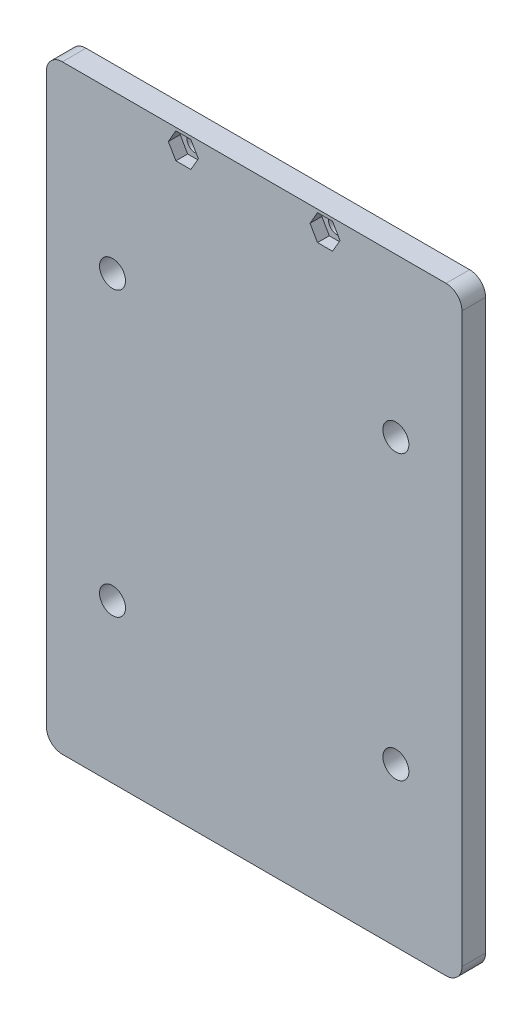
ISO-10303-21;
HEADER;
FILE_DESCRIPTION(('STEP AP214'),'2;1');
FILE_NAME('part.step','',(''),(''),'','','');
FILE_SCHEMA(('AUTOMOTIVE_DESIGN { 1 0 10303 214 1 1 1 1 }'));
ENDSEC;
DATA;
#1=APPLICATION_CONTEXT('core data for automotive mechanical design processes');
#2=APPLICATION_PROTOCOL_DEFINITION('international standard','automotive_design',2000,#1);
#3=PRODUCT_CONTEXT('',#1,'mechanical');
#4=PRODUCT('Part','Part','',(#3));
#5=PRODUCT_RELATED_PRODUCT_CATEGORY('part','',(#4));
#6=PRODUCT_DEFINITION_FORMATION('','',#4);
#7=PRODUCT_DEFINITION_CONTEXT('part definition',#1,'design');
#8=PRODUCT_DEFINITION('design','',#6,#7);
#9=PRODUCT_DEFINITION_SHAPE('','',#8);
#10=(LENGTH_UNIT() NAMED_UNIT(*) SI_UNIT(.MILLI.,.METRE.));
#11=(NAMED_UNIT(*) PLANE_ANGLE_UNIT() SI_UNIT($,.RADIAN.));
#12=(NAMED_UNIT(*) SI_UNIT($,.STERADIAN.) SOLID_ANGLE_UNIT());
#13=UNCERTAINTY_MEASURE_WITH_UNIT(LENGTH_MEASURE(1.E-05),#10,'distance_accuracy_value','');
#14=(GEOMETRIC_REPRESENTATION_CONTEXT(3) GLOBAL_UNCERTAINTY_ASSIGNED_CONTEXT((#13)) GLOBAL_UNIT_ASSIGNED_CONTEXT((#10,
#11,#12)) REPRESENTATION_CONTEXT('',''));
#15=CARTESIAN_POINT('',(0.,0.,0.));
#16=DIRECTION('',(0.,0.,1.));
#17=DIRECTION('',(1.,0.,0.));
#18=AXIS2_PLACEMENT_3D('',#15,#16,#17);
#19=CARTESIAN_POINT('',(386.881443411119,-1203.51516297916,5.));
#20=DIRECTION('',(0.,0.,-1.));
#21=DIRECTION('',(-1.,0.,0.));
#22=AXIS2_PLACEMENT_3D('',#19,#20,#21);
#23=CYLINDRICAL_SURFACE('',#22,1.74999999999997);
#24=CARTESIAN_POINT('',(386.881443411119,-1203.51516297916,0.));
#25=DIRECTION('',(0.,0.,1.));
#26=DIRECTION('',(1.,0.,0.));
#27=AXIS2_PLACEMENT_3D('',#24,#25,#26);
#28=CIRCLE('',#27,1.74999999999997);
#29=CARTESIAN_POINT('',(388.631443411119,-1203.51516297916,0.));
#30=VERTEX_POINT('',#29);
#31=EDGE_CURVE('E287',#30,#30,#28,.T.);
#32=ORIENTED_EDGE('',*,*,#31,.F.);
#33=EDGE_LOOP('',(#32));
#34=FACE_BOUND('',#33,.T.);
#35=CARTESIAN_POINT('',(386.881443411119,-1203.51516297916,2.5));
#36=DIRECTION('',(0.,0.,1.));
#37=DIRECTION('',(1.,0.,0.));
#38=AXIS2_PLACEMENT_3D('',#35,#36,#37);
#39=CIRCLE('',#38,1.74999999999997);
#40=CARTESIAN_POINT('',(388.631443411119,-1203.51516297916,2.5));
#41=VERTEX_POINT('',#40);
#42=EDGE_CURVE('E48',#41,#41,#39,.T.);
#43=ORIENTED_EDGE('',*,*,#42,.T.);
#44=EDGE_LOOP('',(#43));
#45=FACE_BOUND('',#44,.T.);
#46=ADVANCED_FACE('F44',(#34,#45),#23,.F.);
#47=CARTESIAN_POINT('',(416.881443411119,-1203.51516297916,5.));
#48=DIRECTION('',(0.,0.,-1.));
#49=DIRECTION('',(-1.,0.,0.));
#50=AXIS2_PLACEMENT_3D('',#47,#48,#49);
#51=CYLINDRICAL_SURFACE('',#50,1.74999999999997);
#52=CARTESIAN_POINT('',(416.881443411119,-1203.51516297916,0.));
#53=DIRECTION('',(0.,0.,1.));
#54=DIRECTION('',(1.,0.,0.));
#55=AXIS2_PLACEMENT_3D('',#52,#53,#54);
#56=CIRCLE('',#55,1.74999999999997);
#57=CARTESIAN_POINT('',(418.631443411119,-1203.51516297916,0.));
#58=VERTEX_POINT('',#57);
#59=EDGE_CURVE('E284',#58,#58,#56,.T.);
#60=ORIENTED_EDGE('',*,*,#59,.F.);
#61=EDGE_LOOP('',(#60));
#62=FACE_BOUND('',#61,.T.);
#63=CARTESIAN_POINT('',(416.881443411119,-1203.51516297916,2.5));
#64=DIRECTION('',(0.,0.,1.));
#65=DIRECTION('',(1.,0.,0.));
#66=AXIS2_PLACEMENT_3D('',#63,#64,#65);
#67=CIRCLE('',#66,1.74999999999997);
#68=CARTESIAN_POINT('',(418.631443411119,-1203.51516297916,2.5));
#69=VERTEX_POINT('',#68);
#70=EDGE_CURVE('E230',#69,#69,#67,.T.);
#71=ORIENTED_EDGE('',*,*,#70,.T.);
#72=EDGE_LOOP('',(#71));
#73=FACE_BOUND('',#72,.T.);
#74=ADVANCED_FACE('F383',(#62,#73),#51,.F.);
#75=CARTESIAN_POINT('',(442.501443411121,-1323.74516297915,5.));
#76=DIRECTION('',(0.,0.,1.));
#77=DIRECTION('',(1.,0.,0.));
#78=AXIS2_PLACEMENT_3D('',#75,#76,#77);
#79=PLANE('',#78);
#80=DIRECTION('',(-0.500000000000006,0.866025403784435,0.));
#81=VECTOR('',#80,1.);
#82=CARTESIAN_POINT('',(390.056869891662,-1203.51516297916,5.));
#83=LINE('',#82,#81);
#84=CARTESIAN_POINT('',(390.056869891662,-1203.51516297916,5.));
#85=VERTEX_POINT('',#84);
#86=CARTESIAN_POINT('',(388.469156651391,-1200.76516297916,5.));
#87=VERTEX_POINT('',#86);
#88=EDGE_CURVE('E61',#85,#87,#83,.T.);
#89=ORIENTED_EDGE('',*,*,#88,.F.);
#90=DIRECTION('',(0.499999999999993,0.866025403784442,0.));
#91=VECTOR('',#90,1.);
#92=CARTESIAN_POINT('',(388.469156651391,-1206.26516297916,5.));
#93=LINE('',#92,#91);
#94=CARTESIAN_POINT('',(388.469156651391,-1206.26516297916,5.));
#95=VERTEX_POINT('',#94);
#96=EDGE_CURVE('E204',#95,#85,#93,.T.);
#97=ORIENTED_EDGE('',*,*,#96,.F.);
#98=DIRECTION('',(1.,0.,0.));
#99=VECTOR('',#98,1.);
#100=CARTESIAN_POINT('',(385.293730170848,-1206.26516297916,5.));
#101=LINE('',#100,#99);
#102=CARTESIAN_POINT('',(385.293730170848,-1206.26516297916,5.));
#103=VERTEX_POINT('',#102);
#104=EDGE_CURVE('E207',#103,#95,#101,.T.);
#105=ORIENTED_EDGE('',*,*,#104,.F.);
#106=DIRECTION('',(0.500000000000006,-0.866025403784435,0.));
#107=VECTOR('',#106,1.);
#108=CARTESIAN_POINT('',(383.706016930576,-1203.51516297916,5.));
#109=LINE('',#108,#107);
#110=CARTESIAN_POINT('',(383.706016930576,-1203.51516297916,5.));
#111=VERTEX_POINT('',#110);
#112=EDGE_CURVE('E223',#111,#103,#109,.T.);
#113=ORIENTED_EDGE('',*,*,#112,.F.);
#114=DIRECTION('',(-0.499999999999993,-0.866025403784442,0.));
#115=VECTOR('',#114,1.);
#116=CARTESIAN_POINT('',(385.293730170848,-1200.76516297916,5.));
#117=LINE('',#116,#115);
#118=CARTESIAN_POINT('',(385.293730170848,-1200.76516297916,5.));
#119=VERTEX_POINT('',#118);
#120=EDGE_CURVE('E220',#119,#111,#117,.T.);
#121=ORIENTED_EDGE('',*,*,#120,.F.);
#122=DIRECTION('',(-1.,0.,0.));
#123=VECTOR('',#122,1.);
#124=CARTESIAN_POINT('',(388.469156651391,-1200.76516297916,5.));
#125=LINE('',#124,#123);
#126=EDGE_CURVE('E218',#87,#119,#125,.T.);
#127=ORIENTED_EDGE('',*,*,#126,.F.);
#128=EDGE_LOOP('',(#89,#97,#105,#113,#121,#127));
#129=FACE_BOUND('',#128,.T.);
#130=DIRECTION('',(-0.500000000000011,0.866025403784433,0.));
#131=VECTOR('',#130,1.);
#132=CARTESIAN_POINT('',(420.056869891662,-1203.51516297916,5.));
#133=LINE('',#132,#131);
#134=CARTESIAN_POINT('',(420.056869891662,-1203.51516297916,5.));
#135=VERTEX_POINT('',#134);
#136=CARTESIAN_POINT('',(418.469156651391,-1200.76516297916,5.));
#137=VERTEX_POINT('',#136);
#138=EDGE_CURVE('E69',#135,#137,#133,.T.);
#139=ORIENTED_EDGE('',*,*,#138,.F.);
#140=DIRECTION('',(0.499999999999989,0.866025403784445,0.));
#141=VECTOR('',#140,1.);
#142=CARTESIAN_POINT('',(418.469156651391,-1206.26516297916,5.));
#143=LINE('',#142,#141);
#144=CARTESIAN_POINT('',(418.469156651391,-1206.26516297916,5.));
#145=VERTEX_POINT('',#144);
#146=EDGE_CURVE('E251',#145,#135,#143,.T.);
#147=ORIENTED_EDGE('',*,*,#146,.F.);
#148=DIRECTION('',(1.,0.,0.));
#149=VECTOR('',#148,1.);
#150=CARTESIAN_POINT('',(415.293730170847,-1206.26516297916,5.));
#151=LINE('',#150,#149);
#152=CARTESIAN_POINT('',(415.293730170847,-1206.26516297916,5.));
#153=VERTEX_POINT('',#152);
#154=EDGE_CURVE('E254',#153,#145,#151,.T.);
#155=ORIENTED_EDGE('',*,*,#154,.F.);
#156=DIRECTION('',(0.499999999999984,-0.866025403784448,0.));
#157=VECTOR('',#156,1.);
#158=CARTESIAN_POINT('',(413.706016930576,-1203.51516297916,5.));
#159=LINE('',#158,#157);
#160=CARTESIAN_POINT('',(413.706016930576,-1203.51516297916,5.));
#161=VERTEX_POINT('',#160);
#162=EDGE_CURVE('E258',#161,#153,#159,.T.);
#163=ORIENTED_EDGE('',*,*,#162,.F.);
#164=DIRECTION('',(-0.500000000000002,-0.866025403784437,0.));
#165=VECTOR('',#164,1.);
#166=CARTESIAN_POINT('',(415.293730170848,-1200.76516297916,5.));
#167=LINE('',#166,#165);
#168=CARTESIAN_POINT('',(415.293730170848,-1200.76516297916,5.));
#169=VERTEX_POINT('',#168);
#170=EDGE_CURVE('E261',#169,#161,#167,.T.);
#171=ORIENTED_EDGE('',*,*,#170,.F.);
#172=DIRECTION('',(-1.,0.,0.));
#173=VECTOR('',#172,1.);
#174=CARTESIAN_POINT('',(418.469156651391,-1200.76516297916,5.));
#175=LINE('',#174,#173);
#176=EDGE_CURVE('E264',#137,#169,#175,.T.);
#177=ORIENTED_EDGE('',*,*,#176,.F.);
#178=EDGE_LOOP('',(#139,#147,#155,#163,#171,#177));
#179=FACE_BOUND('',#178,.T.);
#180=CARTESIAN_POINT('',(371.881443411121,-1293.62516297915,5.));
#181=DIRECTION('',(0.,0.,1.));
#182=DIRECTION('',(1.,0.,0.));
#183=AXIS2_PLACEMENT_3D('',#180,#181,#182);
#184=CIRCLE('',#183,2.74999999999997);
#185=CARTESIAN_POINT('',(374.631443411121,-1293.62516297915,5.));
#186=VERTEX_POINT('',#185);
#187=EDGE_CURVE('E297',#186,#186,#184,.T.);
#188=ORIENTED_EDGE('',*,*,#187,.F.);
#189=EDGE_LOOP('',(#188));
#190=FACE_BOUND('',#189,.T.);
#191=CARTESIAN_POINT('',(371.881443411121,-1233.62516297915,5.));
#192=DIRECTION('',(0.,0.,1.));
#193=DIRECTION('',(1.,0.,0.));
#194=AXIS2_PLACEMENT_3D('',#191,#192,#193);
#195=CIRCLE('',#194,2.74999999999997);
#196=CARTESIAN_POINT('',(374.631443411121,-1233.62516297915,5.));
#197=VERTEX_POINT('',#196);
#198=EDGE_CURVE('E309',#197,#197,#195,.T.);
#199=ORIENTED_EDGE('',*,*,#198,.F.);
#200=EDGE_LOOP('',(#199));
#201=FACE_BOUND('',#200,.T.);
#202=CARTESIAN_POINT('',(442.501443411121,-1323.74516297915,5.));
#203=DIRECTION('',(0.,0.,1.));
#204=DIRECTION('',(1.,0.,0.));
#205=AXIS2_PLACEMENT_3D('',#202,#203,#204);
#206=CIRCLE('',#205,3.37999999999994);
#207=CARTESIAN_POINT('',(442.501443411121,-1327.12516297915,5.));
#208=VERTEX_POINT('',#207);
#209=CARTESIAN_POINT('',(445.881443411121,-1323.74516297915,5.));
#210=VERTEX_POINT('',#209);
#211=EDGE_CURVE('E315',#208,#210,#206,.T.);
#212=ORIENTED_EDGE('',*,*,#211,.T.);
#213=DIRECTION('',(0.,1.,0.));
#214=VECTOR('',#213,1.);
#215=CARTESIAN_POINT('',(445.881443411121,-1323.74516297915,5.));
#216=LINE('',#215,#214);
#217=CARTESIAN_POINT('',(445.881443411121,-1203.50516297915,5.));
#218=VERTEX_POINT('',#217);
#219=EDGE_CURVE('E318',#210,#218,#216,.T.);
#220=ORIENTED_EDGE('',*,*,#219,.T.);
#221=CARTESIAN_POINT('',(442.501443411121,-1203.50516297915,5.));
#222=DIRECTION('',(0.,0.,1.));
#223=DIRECTION('',(1.,0.,0.));
#224=AXIS2_PLACEMENT_3D('',#221,#222,#223);
#225=CIRCLE('',#224,3.38000000000008);
#226=CARTESIAN_POINT('',(442.501443411121,-1200.12516297915,5.));
#227=VERTEX_POINT('',#226);
#228=EDGE_CURVE('E321',#218,#227,#225,.T.);
#229=ORIENTED_EDGE('',*,*,#228,.T.);
#230=DIRECTION('',(-1.,0.,0.));
#231=VECTOR('',#230,1.);
#232=CARTESIAN_POINT('',(442.501443411121,-1200.12516297915,5.));
#233=LINE('',#232,#231);
#234=CARTESIAN_POINT('',(361.261443411121,-1200.12516297915,5.));
#235=VERTEX_POINT('',#234);
#236=EDGE_CURVE('E323',#227,#235,#233,.T.);
#237=ORIENTED_EDGE('',*,*,#236,.T.);
#238=CARTESIAN_POINT('',(361.261443411121,-1203.50516297915,5.));
#239=DIRECTION('',(0.,0.,1.));
#240=DIRECTION('',(1.,0.,0.));
#241=AXIS2_PLACEMENT_3D('',#238,#239,#240);
#242=CIRCLE('',#241,3.37999999999994);
#243=CARTESIAN_POINT('',(357.881443411121,-1203.50516297915,5.));
#244=VERTEX_POINT('',#243);
#245=EDGE_CURVE('E325',#235,#244,#242,.T.);
#246=ORIENTED_EDGE('',*,*,#245,.T.);
#247=DIRECTION('',(0.,-1.,0.));
#248=VECTOR('',#247,1.);
#249=CARTESIAN_POINT('',(357.881443411121,-1203.50516297915,5.));
#250=LINE('',#249,#248);
#251=CARTESIAN_POINT('',(357.881443411121,-1323.74516297915,5.));
#252=VERTEX_POINT('',#251);
#253=EDGE_CURVE('E327',#244,#252,#250,.T.);
#254=ORIENTED_EDGE('',*,*,#253,.T.);
#255=CARTESIAN_POINT('',(361.261443411121,-1323.74516297915,5.));
#256=DIRECTION('',(0.,0.,1.));
#257=DIRECTION('',(1.,0.,0.));
#258=AXIS2_PLACEMENT_3D('',#255,#256,#257);
#259=CIRCLE('',#258,3.38000000000008);
#260=CARTESIAN_POINT('',(361.261443411121,-1327.12516297915,5.));
#261=VERTEX_POINT('',#260);
#262=EDGE_CURVE('E329',#252,#261,#259,.T.);
#263=ORIENTED_EDGE('',*,*,#262,.T.);
#264=DIRECTION('',(1.,0.,0.));
#265=VECTOR('',#264,1.);
#266=CARTESIAN_POINT('',(361.261443411121,-1327.12516297915,5.));
#267=LINE('',#266,#265);
#268=EDGE_CURVE('E331',#261,#208,#267,.T.);
#269=ORIENTED_EDGE('',*,*,#268,.T.);
#270=EDGE_LOOP('',(#212,#220,#229,#237,#246,#254,#263,#269));
#271=FACE_BOUND('',#270,.T.);
#272=CARTESIAN_POINT('',(431.881443411121,-1233.62516297915,5.));
#273=DIRECTION('',(0.,0.,1.));
#274=DIRECTION('',(1.,0.,0.));
#275=AXIS2_PLACEMENT_3D('',#272,#273,#274);
#276=CIRCLE('',#275,2.74999999999997);
#277=CARTESIAN_POINT('',(434.631443411121,-1233.62516297915,5.));
#278=VERTEX_POINT('',#277);
#279=EDGE_CURVE('E303',#278,#278,#276,.T.);
#280=ORIENTED_EDGE('',*,*,#279,.F.);
#281=EDGE_LOOP('',(#280));
#282=FACE_BOUND('',#281,.T.);
#283=CARTESIAN_POINT('',(431.881443411121,-1293.62516297915,5.));
#284=DIRECTION('',(0.,0.,1.));
#285=DIRECTION('',(1.,0.,0.));
#286=AXIS2_PLACEMENT_3D('',#283,#284,#285);
#287=CIRCLE('',#286,2.74999999999997);
#288=CARTESIAN_POINT('',(434.631443411121,-1293.62516297915,5.));
#289=VERTEX_POINT('',#288);
#290=EDGE_CURVE('E291',#289,#289,#287,.T.);
#291=ORIENTED_EDGE('',*,*,#290,.F.);
#292=EDGE_LOOP('',(#291));
#293=FACE_BOUND('',#292,.T.);
#294=ADVANCED_FACE('F390',(#129,#179,#190,#201,#271,#282,#293),#79,.T.);
#295=CARTESIAN_POINT('',(442.501443411121,-1323.74516297915,0.));
#296=DIRECTION('',(0.,0.,1.));
#297=DIRECTION('',(1.,0.,0.));
#298=AXIS2_PLACEMENT_3D('',#295,#296,#297);
#299=PLANE('',#298);
#300=CARTESIAN_POINT('',(442.501443411121,-1323.74516297915,0.));
#301=DIRECTION('',(0.,0.,1.));
#302=DIRECTION('',(1.,0.,0.));
#303=AXIS2_PLACEMENT_3D('',#300,#301,#302);
#304=CIRCLE('',#303,3.37999999999994);
#305=CARTESIAN_POINT('',(442.501443411121,-1327.12516297915,0.));
#306=VERTEX_POINT('',#305);
#307=CARTESIAN_POINT('',(445.881443411121,-1323.74516297915,0.));
#308=VERTEX_POINT('',#307);
#309=EDGE_CURVE('E312',#306,#308,#304,.T.);
#310=ORIENTED_EDGE('',*,*,#309,.F.);
#311=DIRECTION('',(1.,0.,0.));
#312=VECTOR('',#311,1.);
#313=CARTESIAN_POINT('',(361.261443411121,-1327.12516297915,0.));
#314=LINE('',#313,#312);
#315=CARTESIAN_POINT('',(361.261443411121,-1327.12516297915,0.));
#316=VERTEX_POINT('',#315);
#317=EDGE_CURVE('E319',#316,#306,#314,.T.);
#318=ORIENTED_EDGE('',*,*,#317,.F.);
#319=CARTESIAN_POINT('',(361.261443411121,-1323.74516297915,0.));
#320=DIRECTION('',(0.,0.,1.));
#321=DIRECTION('',(1.,0.,0.));
#322=AXIS2_PLACEMENT_3D('',#319,#320,#321);
#323=CIRCLE('',#322,3.38000000000008);
#324=CARTESIAN_POINT('',(357.881443411121,-1323.74516297915,0.));
#325=VERTEX_POINT('',#324);
#326=EDGE_CURVE('E346',#325,#316,#323,.T.);
#327=ORIENTED_EDGE('',*,*,#326,.F.);
#328=DIRECTION('',(0.,-1.,0.));
#329=VECTOR('',#328,1.);
#330=CARTESIAN_POINT('',(357.881443411121,-1203.50516297915,0.));
#331=LINE('',#330,#329);
#332=CARTESIAN_POINT('',(357.881443411121,-1203.50516297915,0.));
#333=VERTEX_POINT('',#332);
#334=EDGE_CURVE('E344',#333,#325,#331,.T.);
#335=ORIENTED_EDGE('',*,*,#334,.F.);
#336=CARTESIAN_POINT('',(361.261443411121,-1203.50516297915,0.));
#337=DIRECTION('',(0.,0.,1.));
#338=DIRECTION('',(1.,0.,0.));
#339=AXIS2_PLACEMENT_3D('',#336,#337,#338);
#340=CIRCLE('',#339,3.37999999999994);
#341=CARTESIAN_POINT('',(361.261443411121,-1200.12516297915,0.));
#342=VERTEX_POINT('',#341);
#343=EDGE_CURVE('E342',#342,#333,#340,.T.);
#344=ORIENTED_EDGE('',*,*,#343,.F.);
#345=DIRECTION('',(-1.,0.,0.));
#346=VECTOR('',#345,1.);
#347=CARTESIAN_POINT('',(442.501443411121,-1200.12516297915,0.));
#348=LINE('',#347,#346);
#349=CARTESIAN_POINT('',(442.501443411121,-1200.12516297915,0.));
#350=VERTEX_POINT('',#349);
#351=EDGE_CURVE('E340',#350,#342,#348,.T.);
#352=ORIENTED_EDGE('',*,*,#351,.F.);
#353=CARTESIAN_POINT('',(442.501443411121,-1203.50516297915,0.));
#354=DIRECTION('',(0.,0.,1.));
#355=DIRECTION('',(1.,0.,0.));
#356=AXIS2_PLACEMENT_3D('',#353,#354,#355);
#357=CIRCLE('',#356,3.38000000000008);
#358=CARTESIAN_POINT('',(445.881443411121,-1203.50516297915,0.));
#359=VERTEX_POINT('',#358);
#360=EDGE_CURVE('E338',#359,#350,#357,.T.);
#361=ORIENTED_EDGE('',*,*,#360,.F.);
#362=DIRECTION('',(0.,1.,0.));
#363=VECTOR('',#362,1.);
#364=CARTESIAN_POINT('',(445.881443411121,-1323.74516297915,0.));
#365=LINE('',#364,#363);
#366=EDGE_CURVE('E336',#308,#359,#365,.T.);
#367=ORIENTED_EDGE('',*,*,#366,.F.);
#368=EDGE_LOOP('',(#310,#318,#327,#335,#344,#352,#361,#367));
#369=FACE_BOUND('',#368,.T.);
#370=CARTESIAN_POINT('',(371.881443411121,-1233.62516297915,0.));
#371=DIRECTION('',(0.,0.,1.));
#372=DIRECTION('',(1.,0.,0.));
#373=AXIS2_PLACEMENT_3D('',#370,#371,#372);
#374=CIRCLE('',#373,2.74999999999997);
#375=CARTESIAN_POINT('',(374.631443411121,-1233.62516297915,0.));
#376=VERTEX_POINT('',#375);
#377=EDGE_CURVE('E306',#376,#376,#374,.T.);
#378=ORIENTED_EDGE('',*,*,#377,.T.);
#379=EDGE_LOOP('',(#378));
#380=FACE_BOUND('',#379,.T.);
#381=CARTESIAN_POINT('',(431.881443411121,-1233.62516297915,0.));
#382=DIRECTION('',(0.,0.,1.));
#383=DIRECTION('',(1.,0.,0.));
#384=AXIS2_PLACEMENT_3D('',#381,#382,#383);
#385=CIRCLE('',#384,2.74999999999997);
#386=CARTESIAN_POINT('',(434.631443411121,-1233.62516297915,0.));
#387=VERTEX_POINT('',#386);
#388=EDGE_CURVE('E300',#387,#387,#385,.T.);
#389=ORIENTED_EDGE('',*,*,#388,.T.);
#390=EDGE_LOOP('',(#389));
#391=FACE_BOUND('',#390,.T.);
#392=CARTESIAN_POINT('',(371.881443411121,-1293.62516297915,0.));
#393=DIRECTION('',(0.,0.,1.));
#394=DIRECTION('',(1.,0.,0.));
#395=AXIS2_PLACEMENT_3D('',#392,#393,#394);
#396=CIRCLE('',#395,2.74999999999997);
#397=CARTESIAN_POINT('',(374.631443411121,-1293.62516297915,0.));
#398=VERTEX_POINT('',#397);
#399=EDGE_CURVE('E294',#398,#398,#396,.T.);
#400=ORIENTED_EDGE('',*,*,#399,.T.);
#401=EDGE_LOOP('',(#400));
#402=FACE_BOUND('',#401,.T.);
#403=CARTESIAN_POINT('',(431.881443411121,-1293.62516297915,0.));
#404=DIRECTION('',(0.,0.,1.));
#405=DIRECTION('',(1.,0.,0.));
#406=AXIS2_PLACEMENT_3D('',#403,#404,#405);
#407=CIRCLE('',#406,2.74999999999997);
#408=CARTESIAN_POINT('',(434.631443411121,-1293.62516297915,0.));
#409=VERTEX_POINT('',#408);
#410=EDGE_CURVE('E290',#409,#409,#407,.T.);
#411=ORIENTED_EDGE('',*,*,#410,.T.);
#412=EDGE_LOOP('',(#411));
#413=FACE_BOUND('',#412,.T.);
#414=ORIENTED_EDGE('',*,*,#31,.T.);
#415=EDGE_LOOP('',(#414));
#416=FACE_BOUND('',#415,.T.);
#417=ORIENTED_EDGE('',*,*,#59,.T.);
#418=EDGE_LOOP('',(#417));
#419=FACE_BOUND('',#418,.T.);
#420=ADVANCED_FACE('F415',(#369,#380,#391,#402,#413,#416,#419),#299,.F.);
#421=CARTESIAN_POINT('',(442.501443411121,-1323.74516297915,5.));
#422=DIRECTION('',(0.,0.,-1.));
#423=DIRECTION('',(-1.,0.,0.));
#424=AXIS2_PLACEMENT_3D('',#421,#422,#423);
#425=CYLINDRICAL_SURFACE('',#424,3.37999999999994);
#426=ORIENTED_EDGE('',*,*,#309,.T.);
#427=DIRECTION('',(0.,0.,-1.));
#428=VECTOR('',#427,1.);
#429=CARTESIAN_POINT('',(445.881443411121,-1323.74516297915,5.));
#430=LINE('',#429,#428);
#431=EDGE_CURVE('E11',#210,#308,#430,.T.);
#432=ORIENTED_EDGE('',*,*,#431,.F.);
#433=ORIENTED_EDGE('',*,*,#211,.F.);
#434=DIRECTION('',(0.,0.,-1.));
#435=VECTOR('',#434,1.);
#436=CARTESIAN_POINT('',(442.501443411121,-1327.12516297915,5.));
#437=LINE('',#436,#435);
#438=EDGE_CURVE('E333',#208,#306,#437,.T.);
#439=ORIENTED_EDGE('',*,*,#438,.T.);
#440=EDGE_LOOP('',(#426,#432,#433,#439));
#441=FACE_BOUND('',#440,.T.);
#442=ADVANCED_FACE('F46',(#441),#425,.T.);
#443=CARTESIAN_POINT('',(445.881443411121,-1323.74516297915,5.));
#444=DIRECTION('',(-1.,0.,0.));
#445=DIRECTION('',(0.,0.,1.));
#446=AXIS2_PLACEMENT_3D('',#443,#444,#445);
#447=PLANE('',#446);
#448=ORIENTED_EDGE('',*,*,#366,.T.);
#449=DIRECTION('',(0.,0.,-1.));
#450=VECTOR('',#449,1.);
#451=CARTESIAN_POINT('',(445.881443411121,-1203.50516297915,5.));
#452=LINE('',#451,#450);
#453=EDGE_CURVE('E53',#218,#359,#452,.T.);
#454=ORIENTED_EDGE('',*,*,#453,.F.);
#455=ORIENTED_EDGE('',*,*,#219,.F.);
#456=ORIENTED_EDGE('',*,*,#431,.T.);
#457=EDGE_LOOP('',(#448,#454,#455,#456));
#458=FACE_BOUND('',#457,.T.);
#459=ADVANCED_FACE('F441',(#458),#447,.F.);
#460=CARTESIAN_POINT('',(442.501443411121,-1203.50516297915,5.));
#461=DIRECTION('',(0.,0.,-1.));
#462=DIRECTION('',(-1.,0.,0.));
#463=AXIS2_PLACEMENT_3D('',#460,#461,#462);
#464=CYLINDRICAL_SURFACE('',#463,3.38000000000008);
#465=ORIENTED_EDGE('',*,*,#360,.T.);
#466=DIRECTION('',(0.,0.,-1.));
#467=VECTOR('',#466,1.);
#468=CARTESIAN_POINT('',(442.501443411121,-1200.12516297915,5.));
#469=LINE('',#468,#467);
#470=EDGE_CURVE('E363',#227,#350,#469,.T.);
#471=ORIENTED_EDGE('',*,*,#470,.F.);
#472=ORIENTED_EDGE('',*,*,#228,.F.);
#473=ORIENTED_EDGE('',*,*,#453,.T.);
#474=EDGE_LOOP('',(#465,#471,#472,#473));
#475=FACE_BOUND('',#474,.T.);
#476=ADVANCED_FACE('F438',(#475),#464,.T.);
#477=CARTESIAN_POINT('',(442.501443411121,-1200.12516297915,5.));
#478=DIRECTION('',(0.,-1.,0.));
#479=DIRECTION('',(1.,0.,0.));
#480=AXIS2_PLACEMENT_3D('',#477,#478,#479);
#481=PLANE('',#480);
#482=ORIENTED_EDGE('',*,*,#351,.T.);
#483=DIRECTION('',(0.,0.,-1.));
#484=VECTOR('',#483,1.);
#485=CARTESIAN_POINT('',(361.261443411121,-1200.12516297915,5.));
#486=LINE('',#485,#484);
#487=EDGE_CURVE('E360',#235,#342,#486,.T.);
#488=ORIENTED_EDGE('',*,*,#487,.F.);
#489=ORIENTED_EDGE('',*,*,#236,.F.);
#490=ORIENTED_EDGE('',*,*,#470,.T.);
#491=EDGE_LOOP('',(#482,#488,#489,#490));
#492=FACE_BOUND('',#491,.T.);
#493=ADVANCED_FACE('F434',(#492),#481,.F.);
#494=CARTESIAN_POINT('',(361.261443411121,-1203.50516297915,5.));
#495=DIRECTION('',(0.,0.,-1.));
#496=DIRECTION('',(-1.,0.,0.));
#497=AXIS2_PLACEMENT_3D('',#494,#495,#496);
#498=CYLINDRICAL_SURFACE('',#497,3.37999999999994);
#499=ORIENTED_EDGE('',*,*,#343,.T.);
#500=DIRECTION('',(0.,0.,-1.));
#501=VECTOR('',#500,1.);
#502=CARTESIAN_POINT('',(357.881443411121,-1203.50516297915,5.));
#503=LINE('',#502,#501);
#504=EDGE_CURVE('E357',#244,#333,#503,.T.);
#505=ORIENTED_EDGE('',*,*,#504,.F.);
#506=ORIENTED_EDGE('',*,*,#245,.F.);
#507=ORIENTED_EDGE('',*,*,#487,.T.);
#508=EDGE_LOOP('',(#499,#505,#506,#507));
#509=FACE_BOUND('',#508,.T.);
#510=ADVANCED_FACE('F430',(#509),#498,.T.);
#511=CARTESIAN_POINT('',(357.881443411121,-1203.50516297915,5.));
#512=DIRECTION('',(1.,0.,0.));
#513=DIRECTION('',(0.,0.,-1.));
#514=AXIS2_PLACEMENT_3D('',#511,#512,#513);
#515=PLANE('',#514);
#516=ORIENTED_EDGE('',*,*,#334,.T.);
#517=DIRECTION('',(0.,0.,-1.));
#518=VECTOR('',#517,1.);
#519=CARTESIAN_POINT('',(357.881443411121,-1323.74516297915,5.));
#520=LINE('',#519,#518);
#521=EDGE_CURVE('E354',#252,#325,#520,.T.);
#522=ORIENTED_EDGE('',*,*,#521,.F.);
#523=ORIENTED_EDGE('',*,*,#253,.F.);
#524=ORIENTED_EDGE('',*,*,#504,.T.);
#525=EDGE_LOOP('',(#516,#522,#523,#524));
#526=FACE_BOUND('',#525,.T.);
#527=ADVANCED_FACE('F426',(#526),#515,.F.);
#528=CARTESIAN_POINT('',(361.261443411121,-1323.74516297915,5.));
#529=DIRECTION('',(0.,0.,-1.));
#530=DIRECTION('',(-1.,0.,0.));
#531=AXIS2_PLACEMENT_3D('',#528,#529,#530);
#532=CYLINDRICAL_SURFACE('',#531,3.38000000000008);
#533=ORIENTED_EDGE('',*,*,#326,.T.);
#534=DIRECTION('',(0.,0.,-1.));
#535=VECTOR('',#534,1.);
#536=CARTESIAN_POINT('',(361.261443411121,-1327.12516297915,5.));
#537=LINE('',#536,#535);
#538=EDGE_CURVE('E351',#261,#316,#537,.T.);
#539=ORIENTED_EDGE('',*,*,#538,.F.);
#540=ORIENTED_EDGE('',*,*,#262,.F.);
#541=ORIENTED_EDGE('',*,*,#521,.T.);
#542=EDGE_LOOP('',(#533,#539,#540,#541));
#543=FACE_BOUND('',#542,.T.);
#544=ADVANCED_FACE('F422',(#543),#532,.T.);
#545=CARTESIAN_POINT('',(361.261443411121,-1327.12516297915,5.));
#546=DIRECTION('',(0.,1.,0.));
#547=DIRECTION('',(-1.,0.,0.));
#548=AXIS2_PLACEMENT_3D('',#545,#546,#547);
#549=PLANE('',#548);
#550=ORIENTED_EDGE('',*,*,#317,.T.);
#551=ORIENTED_EDGE('',*,*,#438,.F.);
#552=ORIENTED_EDGE('',*,*,#268,.F.);
#553=ORIENTED_EDGE('',*,*,#538,.T.);
#554=EDGE_LOOP('',(#550,#551,#552,#553));
#555=FACE_BOUND('',#554,.T.);
#556=ADVANCED_FACE('F411',(#555),#549,.F.);
#557=CARTESIAN_POINT('',(371.881443411121,-1233.62516297915,5.));
#558=DIRECTION('',(0.,0.,-1.));
#559=DIRECTION('',(-1.,0.,0.));
#560=AXIS2_PLACEMENT_3D('',#557,#558,#559);
#561=CYLINDRICAL_SURFACE('',#560,2.74999999999997);
#562=ORIENTED_EDGE('',*,*,#198,.T.);
#563=EDGE_LOOP('',(#562));
#564=FACE_BOUND('',#563,.T.);
#565=ORIENTED_EDGE('',*,*,#377,.F.);
#566=EDGE_LOOP('',(#565));
#567=FACE_BOUND('',#566,.T.);
#568=ADVANCED_FACE('F407',(#564,#567),#561,.F.);
#569=CARTESIAN_POINT('',(431.881443411121,-1233.62516297915,5.));
#570=DIRECTION('',(0.,0.,-1.));
#571=DIRECTION('',(-1.,0.,0.));
#572=AXIS2_PLACEMENT_3D('',#569,#570,#571);
#573=CYLINDRICAL_SURFACE('',#572,2.74999999999997);
#574=ORIENTED_EDGE('',*,*,#279,.T.);
#575=EDGE_LOOP('',(#574));
#576=FACE_BOUND('',#575,.T.);
#577=ORIENTED_EDGE('',*,*,#388,.F.);
#578=EDGE_LOOP('',(#577));
#579=FACE_BOUND('',#578,.T.);
#580=ADVANCED_FACE('F403',(#576,#579),#573,.F.);
#581=CARTESIAN_POINT('',(371.881443411121,-1293.62516297915,5.));
#582=DIRECTION('',(0.,0.,-1.));
#583=DIRECTION('',(-1.,0.,0.));
#584=AXIS2_PLACEMENT_3D('',#581,#582,#583);
#585=CYLINDRICAL_SURFACE('',#584,2.74999999999997);
#586=ORIENTED_EDGE('',*,*,#187,.T.);
#587=EDGE_LOOP('',(#586));
#588=FACE_BOUND('',#587,.T.);
#589=ORIENTED_EDGE('',*,*,#399,.F.);
#590=EDGE_LOOP('',(#589));
#591=FACE_BOUND('',#590,.T.);
#592=ADVANCED_FACE('F399',(#588,#591),#585,.F.);
#593=CARTESIAN_POINT('',(431.881443411121,-1293.62516297915,5.));
#594=DIRECTION('',(0.,0.,-1.));
#595=DIRECTION('',(-1.,0.,0.));
#596=AXIS2_PLACEMENT_3D('',#593,#594,#595);
#597=CYLINDRICAL_SURFACE('',#596,2.74999999999997);
#598=ORIENTED_EDGE('',*,*,#290,.T.);
#599=EDGE_LOOP('',(#598));
#600=FACE_BOUND('',#599,.T.);
#601=ORIENTED_EDGE('',*,*,#410,.F.);
#602=EDGE_LOOP('',(#601));
#603=FACE_BOUND('',#602,.T.);
#604=ADVANCED_FACE('F396',(#600,#603),#597,.F.);
#605=CARTESIAN_POINT('',(420.056869891662,-1203.51516297916,2.5));
#606=DIRECTION('',(0.866025403784433,0.500000000000011,0.));
#607=DIRECTION('',(-0.500000000000011,0.866025403784433,0.));
#608=AXIS2_PLACEMENT_3D('',#605,#606,#607);
#609=PLANE('',#608);
#610=ORIENTED_EDGE('',*,*,#138,.T.);
#611=DIRECTION('',(0.,0.,1.));
#612=VECTOR('',#611,1.);
#613=CARTESIAN_POINT('',(418.469156651391,-1200.76516297916,2.5));
#614=LINE('',#613,#612);
#615=CARTESIAN_POINT('',(418.469156651391,-1200.76516297916,2.5));
#616=VERTEX_POINT('',#615);
#617=EDGE_CURVE('E238',#616,#137,#614,.T.);
#618=ORIENTED_EDGE('',*,*,#617,.F.);
#619=DIRECTION('',(-0.500000000000011,0.866025403784433,0.));
#620=VECTOR('',#619,1.);
#621=CARTESIAN_POINT('',(420.056869891662,-1203.51516297916,2.5));
#622=LINE('',#621,#620);
#623=CARTESIAN_POINT('',(420.056869891662,-1203.51516297916,2.5));
#624=VERTEX_POINT('',#623);
#625=EDGE_CURVE('E255',#624,#616,#622,.T.);
#626=ORIENTED_EDGE('',*,*,#625,.F.);
#627=DIRECTION('',(0.,0.,1.));
#628=VECTOR('',#627,1.);
#629=CARTESIAN_POINT('',(420.056869891662,-1203.51516297916,2.5));
#630=LINE('',#629,#628);
#631=EDGE_CURVE('E249',#624,#135,#630,.T.);
#632=ORIENTED_EDGE('',*,*,#631,.T.);
#633=EDGE_LOOP('',(#610,#618,#626,#632));
#634=FACE_BOUND('',#633,.T.);
#635=ADVANCED_FACE('F398',(#634),#609,.F.);
#636=CARTESIAN_POINT('',(418.469156651391,-1206.26516297916,2.5));
#637=DIRECTION('',(0.866025403784445,-0.499999999999989,0.));
#638=DIRECTION('',(0.499999999999989,0.866025403784445,0.));
#639=AXIS2_PLACEMENT_3D('',#636,#637,#638);
#640=PLANE('',#639);
#641=ORIENTED_EDGE('',*,*,#146,.T.);
#642=ORIENTED_EDGE('',*,*,#631,.F.);
#643=DIRECTION('',(0.499999999999989,0.866025403784445,0.));
#644=VECTOR('',#643,1.);
#645=CARTESIAN_POINT('',(418.469156651391,-1206.26516297916,2.5));
#646=LINE('',#645,#644);
#647=CARTESIAN_POINT('',(418.469156651391,-1206.26516297916,2.5));
#648=VERTEX_POINT('',#647);
#649=EDGE_CURVE('E240',#648,#624,#646,.T.);
#650=ORIENTED_EDGE('',*,*,#649,.F.);
#651=DIRECTION('',(0.,0.,1.));
#652=VECTOR('',#651,1.);
#653=CARTESIAN_POINT('',(418.469156651391,-1206.26516297916,2.5));
#654=LINE('',#653,#652);
#655=EDGE_CURVE('E247',#648,#145,#654,.T.);
#656=ORIENTED_EDGE('',*,*,#655,.T.);
#657=EDGE_LOOP('',(#641,#642,#650,#656));
#658=FACE_BOUND('',#657,.T.);
#659=ADVANCED_FACE('F514',(#658),#640,.F.);
#660=CARTESIAN_POINT('',(415.293730170847,-1206.26516297916,2.5));
#661=DIRECTION('',(0.,-1.,0.));
#662=DIRECTION('',(0.,0.,-1.));
#663=AXIS2_PLACEMENT_3D('',#660,#661,#662);
#664=PLANE('',#663);
#665=ORIENTED_EDGE('',*,*,#154,.T.);
#666=ORIENTED_EDGE('',*,*,#655,.F.);
#667=DIRECTION('',(1.,0.,0.));
#668=VECTOR('',#667,1.);
#669=CARTESIAN_POINT('',(415.293730170847,-1206.26516297916,2.5));
#670=LINE('',#669,#668);
#671=CARTESIAN_POINT('',(415.293730170847,-1206.26516297916,2.5));
#672=VERTEX_POINT('',#671);
#673=EDGE_CURVE('E270',#672,#648,#670,.T.);
#674=ORIENTED_EDGE('',*,*,#673,.F.);
#675=DIRECTION('',(0.,0.,1.));
#676=VECTOR('',#675,1.);
#677=CARTESIAN_POINT('',(415.293730170847,-1206.26516297916,2.5));
#678=LINE('',#677,#676);
#679=EDGE_CURVE('E245',#672,#153,#678,.T.);
#680=ORIENTED_EDGE('',*,*,#679,.T.);
#681=EDGE_LOOP('',(#665,#666,#674,#680));
#682=FACE_BOUND('',#681,.T.);
#683=ADVANCED_FACE('F523',(#682),#664,.F.);
#684=CARTESIAN_POINT('',(413.706016930576,-1203.51516297916,2.5));
#685=DIRECTION('',(-0.866025403784448,-0.499999999999984,0.));
#686=DIRECTION('',(0.499999999999984,-0.866025403784448,0.));
#687=AXIS2_PLACEMENT_3D('',#684,#685,#686);
#688=PLANE('',#687);
#689=ORIENTED_EDGE('',*,*,#162,.T.);
#690=ORIENTED_EDGE('',*,*,#679,.F.);
#691=DIRECTION('',(0.499999999999984,-0.866025403784448,0.));
#692=VECTOR('',#691,1.);
#693=CARTESIAN_POINT('',(413.706016930576,-1203.51516297916,2.5));
#694=LINE('',#693,#692);
#695=CARTESIAN_POINT('',(413.706016930576,-1203.51516297916,2.5));
#696=VERTEX_POINT('',#695);
#697=EDGE_CURVE('E273',#696,#672,#694,.T.);
#698=ORIENTED_EDGE('',*,*,#697,.F.);
#699=DIRECTION('',(0.,0.,1.));
#700=VECTOR('',#699,1.);
#701=CARTESIAN_POINT('',(413.706016930576,-1203.51516297916,2.5));
#702=LINE('',#701,#700);
#703=EDGE_CURVE('E243',#696,#161,#702,.T.);
#704=ORIENTED_EDGE('',*,*,#703,.T.);
#705=EDGE_LOOP('',(#689,#690,#698,#704));
#706=FACE_BOUND('',#705,.T.);
#707=ADVANCED_FACE('F532',(#706),#688,.F.);
#708=CARTESIAN_POINT('',(415.293730170848,-1200.76516297916,2.5));
#709=DIRECTION('',(-0.866025403784437,0.500000000000002,0.));
#710=DIRECTION('',(-0.500000000000002,-0.866025403784437,0.));
#711=AXIS2_PLACEMENT_3D('',#708,#709,#710);
#712=PLANE('',#711);
#713=ORIENTED_EDGE('',*,*,#170,.T.);
#714=ORIENTED_EDGE('',*,*,#703,.F.);
#715=DIRECTION('',(-0.500000000000002,-0.866025403784437,0.));
#716=VECTOR('',#715,1.);
#717=CARTESIAN_POINT('',(415.293730170848,-1200.76516297916,2.5));
#718=LINE('',#717,#716);
#719=CARTESIAN_POINT('',(415.293730170848,-1200.76516297916,2.5));
#720=VERTEX_POINT('',#719);
#721=EDGE_CURVE('E276',#720,#696,#718,.T.);
#722=ORIENTED_EDGE('',*,*,#721,.F.);
#723=DIRECTION('',(0.,0.,1.));
#724=VECTOR('',#723,1.);
#725=CARTESIAN_POINT('',(415.293730170848,-1200.76516297916,2.5));
#726=LINE('',#725,#724);
#727=EDGE_CURVE('E241',#720,#169,#726,.T.);
#728=ORIENTED_EDGE('',*,*,#727,.T.);
#729=EDGE_LOOP('',(#713,#714,#722,#728));
#730=FACE_BOUND('',#729,.T.);
#731=ADVANCED_FACE('F541',(#730),#712,.F.);
#732=CARTESIAN_POINT('',(418.469156651391,-1200.76516297916,2.5));
#733=DIRECTION('',(0.,1.,0.));
#734=DIRECTION('',(0.,0.,1.));
#735=AXIS2_PLACEMENT_3D('',#732,#733,#734);
#736=PLANE('',#735);
#737=ORIENTED_EDGE('',*,*,#176,.T.);
#738=ORIENTED_EDGE('',*,*,#727,.F.);
#739=DIRECTION('',(-1.,0.,0.));
#740=VECTOR('',#739,1.);
#741=CARTESIAN_POINT('',(418.469156651391,-1200.76516297916,2.5));
#742=LINE('',#741,#740);
#743=EDGE_CURVE('E279',#616,#720,#742,.T.);
#744=ORIENTED_EDGE('',*,*,#743,.F.);
#745=ORIENTED_EDGE('',*,*,#617,.T.);
#746=EDGE_LOOP('',(#737,#738,#744,#745));
#747=FACE_BOUND('',#746,.T.);
#748=ADVANCED_FACE('F550',(#747),#736,.F.);
#749=CARTESIAN_POINT('',(0.,0.,2.5));
#750=DIRECTION('',(0.,0.,1.));
#751=DIRECTION('',(1.,0.,0.));
#752=AXIS2_PLACEMENT_3D('',#749,#750,#751);
#753=PLANE('',#752);
#754=ORIENTED_EDGE('',*,*,#70,.F.);
#755=EDGE_LOOP('',(#754));
#756=FACE_BOUND('',#755,.T.);
#757=ORIENTED_EDGE('',*,*,#625,.T.);
#758=ORIENTED_EDGE('',*,*,#743,.T.);
#759=ORIENTED_EDGE('',*,*,#721,.T.);
#760=ORIENTED_EDGE('',*,*,#697,.T.);
#761=ORIENTED_EDGE('',*,*,#673,.T.);
#762=ORIENTED_EDGE('',*,*,#649,.T.);
#763=EDGE_LOOP('',(#757,#758,#759,#760,#761,#762));
#764=FACE_BOUND('',#763,.T.);
#765=ADVANCED_FACE('F559',(#756,#764),#753,.T.);
#766=CARTESIAN_POINT('',(390.056869891662,-1203.51516297916,2.5));
#767=DIRECTION('',(0.866025403784435,0.500000000000006,0.));
#768=DIRECTION('',(-0.500000000000006,0.866025403784435,0.));
#769=AXIS2_PLACEMENT_3D('',#766,#767,#768);
#770=PLANE('',#769);
#771=ORIENTED_EDGE('',*,*,#88,.T.);
#772=DIRECTION('',(0.,0.,1.));
#773=VECTOR('',#772,1.);
#774=CARTESIAN_POINT('',(388.469156651391,-1200.76516297916,2.5));
#775=LINE('',#774,#773);
#776=CARTESIAN_POINT('',(388.469156651391,-1200.76516297916,2.5));
#777=VERTEX_POINT('',#776);
#778=EDGE_CURVE('E181',#777,#87,#775,.T.);
#779=ORIENTED_EDGE('',*,*,#778,.F.);
#780=DIRECTION('',(-0.500000000000006,0.866025403784435,0.));
#781=VECTOR('',#780,1.);
#782=CARTESIAN_POINT('',(390.056869891662,-1203.51516297916,2.5));
#783=LINE('',#782,#781);
#784=CARTESIAN_POINT('',(390.056869891662,-1203.51516297916,2.5));
#785=VERTEX_POINT('',#784);
#786=EDGE_CURVE('E185',#785,#777,#783,.T.);
#787=ORIENTED_EDGE('',*,*,#786,.F.);
#788=DIRECTION('',(0.,0.,1.));
#789=VECTOR('',#788,1.);
#790=CARTESIAN_POINT('',(390.056869891662,-1203.51516297916,2.5));
#791=LINE('',#790,#789);
#792=EDGE_CURVE('E228',#785,#85,#791,.T.);
#793=ORIENTED_EDGE('',*,*,#792,.T.);
#794=EDGE_LOOP('',(#771,#779,#787,#793));
#795=FACE_BOUND('',#794,.T.);
#796=ADVANCED_FACE('F183',(#795),#770,.F.);
#797=CARTESIAN_POINT('',(388.469156651391,-1206.26516297916,2.5));
#798=DIRECTION('',(0.866025403784442,-0.499999999999993,0.));
#799=DIRECTION('',(0.499999999999993,0.866025403784442,0.));
#800=AXIS2_PLACEMENT_3D('',#797,#798,#799);
#801=PLANE('',#800);
#802=ORIENTED_EDGE('',*,*,#96,.T.);
#803=ORIENTED_EDGE('',*,*,#792,.F.);
#804=DIRECTION('',(0.499999999999993,0.866025403784442,0.));
#805=VECTOR('',#804,1.);
#806=CARTESIAN_POINT('',(388.469156651391,-1206.26516297916,2.5));
#807=LINE('',#806,#805);
#808=CARTESIAN_POINT('',(388.469156651391,-1206.26516297916,2.5));
#809=VERTEX_POINT('',#808);
#810=EDGE_CURVE('E191',#809,#785,#807,.T.);
#811=ORIENTED_EDGE('',*,*,#810,.F.);
#812=DIRECTION('',(0.,0.,1.));
#813=VECTOR('',#812,1.);
#814=CARTESIAN_POINT('',(388.469156651391,-1206.26516297916,2.5));
#815=LINE('',#814,#813);
#816=EDGE_CURVE('E231',#809,#95,#815,.T.);
#817=ORIENTED_EDGE('',*,*,#816,.T.);
#818=EDGE_LOOP('',(#802,#803,#811,#817));
#819=FACE_BOUND('',#818,.T.);
#820=ADVANCED_FACE('F575',(#819),#801,.F.);
#821=CARTESIAN_POINT('',(385.293730170848,-1206.26516297916,2.5));
#822=DIRECTION('',(0.,-1.,0.));
#823=DIRECTION('',(0.,0.,-1.));
#824=AXIS2_PLACEMENT_3D('',#821,#822,#823);
#825=PLANE('',#824);
#826=ORIENTED_EDGE('',*,*,#104,.T.);
#827=ORIENTED_EDGE('',*,*,#816,.F.);
#828=DIRECTION('',(1.,0.,0.));
#829=VECTOR('',#828,1.);
#830=CARTESIAN_POINT('',(385.293730170848,-1206.26516297916,2.5));
#831=LINE('',#830,#829);
#832=CARTESIAN_POINT('',(385.293730170848,-1206.26516297916,2.5));
#833=VERTEX_POINT('',#832);
#834=EDGE_CURVE('E214',#833,#809,#831,.T.);
#835=ORIENTED_EDGE('',*,*,#834,.F.);
#836=DIRECTION('',(0.,0.,1.));
#837=VECTOR('',#836,1.);
#838=CARTESIAN_POINT('',(385.293730170848,-1206.26516297916,2.5));
#839=LINE('',#838,#837);
#840=EDGE_CURVE('E233',#833,#103,#839,.T.);
#841=ORIENTED_EDGE('',*,*,#840,.T.);
#842=EDGE_LOOP('',(#826,#827,#835,#841));
#843=FACE_BOUND('',#842,.T.);
#844=ADVANCED_FACE('F583',(#843),#825,.F.);
#845=CARTESIAN_POINT('',(383.706016930576,-1203.51516297916,2.5));
#846=DIRECTION('',(-0.866025403784435,-0.500000000000006,0.));
#847=DIRECTION('',(0.500000000000006,-0.866025403784435,0.));
#848=AXIS2_PLACEMENT_3D('',#845,#846,#847);
#849=PLANE('',#848);
#850=ORIENTED_EDGE('',*,*,#112,.T.);
#851=ORIENTED_EDGE('',*,*,#840,.F.);
#852=DIRECTION('',(0.500000000000006,-0.866025403784435,0.));
#853=VECTOR('',#852,1.);
#854=CARTESIAN_POINT('',(383.706016930576,-1203.51516297916,2.5));
#855=LINE('',#854,#853);
#856=CARTESIAN_POINT('',(383.706016930576,-1203.51516297916,2.5));
#857=VERTEX_POINT('',#856);
#858=EDGE_CURVE('E211',#857,#833,#855,.T.);
#859=ORIENTED_EDGE('',*,*,#858,.F.);
#860=DIRECTION('',(0.,0.,1.));
#861=VECTOR('',#860,1.);
#862=CARTESIAN_POINT('',(383.706016930576,-1203.51516297916,2.5));
#863=LINE('',#862,#861);
#864=EDGE_CURVE('E235',#857,#111,#863,.T.);
#865=ORIENTED_EDGE('',*,*,#864,.T.);
#866=EDGE_LOOP('',(#850,#851,#859,#865));
#867=FACE_BOUND('',#866,.T.);
#868=ADVANCED_FACE('F591',(#867),#849,.F.);
#869=CARTESIAN_POINT('',(385.293730170848,-1200.76516297916,2.5));
#870=DIRECTION('',(-0.866025403784442,0.499999999999993,0.));
#871=DIRECTION('',(-0.499999999999993,-0.866025403784442,0.));
#872=AXIS2_PLACEMENT_3D('',#869,#870,#871);
#873=PLANE('',#872);
#874=ORIENTED_EDGE('',*,*,#120,.T.);
#875=ORIENTED_EDGE('',*,*,#864,.F.);
#876=DIRECTION('',(-0.499999999999993,-0.866025403784442,0.));
#877=VECTOR('',#876,1.);
#878=CARTESIAN_POINT('',(385.293730170848,-1200.76516297916,2.5));
#879=LINE('',#878,#877);
#880=CARTESIAN_POINT('',(385.293730170848,-1200.76516297916,2.5));
#881=VERTEX_POINT('',#880);
#882=EDGE_CURVE('E199',#881,#857,#879,.T.);
#883=ORIENTED_EDGE('',*,*,#882,.F.);
#884=DIRECTION('',(0.,0.,1.));
#885=VECTOR('',#884,1.);
#886=CARTESIAN_POINT('',(385.293730170848,-1200.76516297916,2.5));
#887=LINE('',#886,#885);
#888=EDGE_CURVE('E190',#881,#119,#887,.T.);
#889=ORIENTED_EDGE('',*,*,#888,.T.);
#890=EDGE_LOOP('',(#874,#875,#883,#889));
#891=FACE_BOUND('',#890,.T.);
#892=ADVANCED_FACE('F379',(#891),#873,.F.);
#893=CARTESIAN_POINT('',(388.469156651391,-1200.76516297916,2.5));
#894=DIRECTION('',(0.,1.,0.));
#895=DIRECTION('',(0.,0.,1.));
#896=AXIS2_PLACEMENT_3D('',#893,#894,#895);
#897=PLANE('',#896);
#898=ORIENTED_EDGE('',*,*,#126,.T.);
#899=ORIENTED_EDGE('',*,*,#888,.F.);
#900=DIRECTION('',(-1.,0.,0.));
#901=VECTOR('',#900,1.);
#902=CARTESIAN_POINT('',(388.469156651391,-1200.76516297916,2.5));
#903=LINE('',#902,#901);
#904=EDGE_CURVE('E194',#777,#881,#903,.T.);
#905=ORIENTED_EDGE('',*,*,#904,.F.);
#906=ORIENTED_EDGE('',*,*,#778,.T.);
#907=EDGE_LOOP('',(#898,#899,#905,#906));
#908=FACE_BOUND('',#907,.T.);
#909=ADVANCED_FACE('F195',(#908),#897,.F.);
#910=CARTESIAN_POINT('',(0.,0.,2.5));
#911=DIRECTION('',(0.,0.,1.));
#912=DIRECTION('',(1.,0.,0.));
#913=AXIS2_PLACEMENT_3D('',#910,#911,#912);
#914=PLANE('',#913);
#915=ORIENTED_EDGE('',*,*,#42,.F.);
#916=EDGE_LOOP('',(#915));
#917=FACE_BOUND('',#916,.T.);
#918=ORIENTED_EDGE('',*,*,#786,.T.);
#919=ORIENTED_EDGE('',*,*,#904,.T.);
#920=ORIENTED_EDGE('',*,*,#882,.T.);
#921=ORIENTED_EDGE('',*,*,#858,.T.);
#922=ORIENTED_EDGE('',*,*,#834,.T.);
#923=ORIENTED_EDGE('',*,*,#810,.T.);
#924=EDGE_LOOP('',(#918,#919,#920,#921,#922,#923));
#925=FACE_BOUND('',#924,.T.);
#926=ADVANCED_FACE('F201',(#917,#925),#914,.T.);
#927=CLOSED_SHELL('',(#46,#74,#294,#420,#442,#459,#476,#493,#510,#527,#544,#556,#568,#580,#592,
#604,#635,#659,#683,#707,#731,#748,#765,#796,#820,#844,#868,#892,#909,#926));
#928=MANIFOLD_SOLID_BREP('B2',#927);
#929=ADVANCED_BREP_SHAPE_REPRESENTATION('',(#18,#928),#14);
#930=SHAPE_DEFINITION_REPRESENTATION(#9,#929);
ENDSEC;
END-ISO-10303-21;
